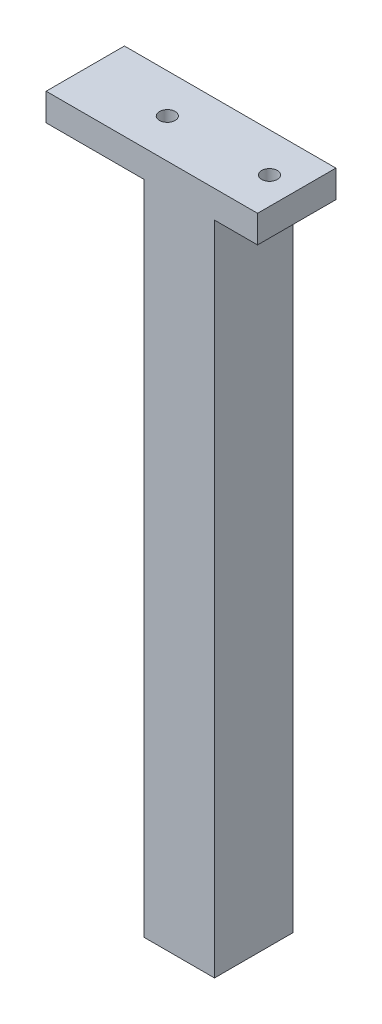
ISO-10303-21;
HEADER;
FILE_DESCRIPTION(('STEP AP214'),'2;1');
FILE_NAME('part.step','',(''),(''),'','','');
FILE_SCHEMA(('AUTOMOTIVE_DESIGN { 1 0 10303 214 1 1 1 1 }'));
ENDSEC;
DATA;
#1=APPLICATION_CONTEXT('core data for automotive mechanical design processes');
#2=APPLICATION_PROTOCOL_DEFINITION('international standard','automotive_design',2000,#1);
#3=PRODUCT_CONTEXT('',#1,'mechanical');
#4=PRODUCT('Part','Part','',(#3));
#5=PRODUCT_RELATED_PRODUCT_CATEGORY('part','',(#4));
#6=PRODUCT_DEFINITION_FORMATION('','',#4);
#7=PRODUCT_DEFINITION_CONTEXT('part definition',#1,'design');
#8=PRODUCT_DEFINITION('design','',#6,#7);
#9=PRODUCT_DEFINITION_SHAPE('','',#8);
#10=(LENGTH_UNIT() NAMED_UNIT(*) SI_UNIT(.MILLI.,.METRE.));
#11=(NAMED_UNIT(*) PLANE_ANGLE_UNIT() SI_UNIT($,.RADIAN.));
#12=(NAMED_UNIT(*) SI_UNIT($,.STERADIAN.) SOLID_ANGLE_UNIT());
#13=UNCERTAINTY_MEASURE_WITH_UNIT(LENGTH_MEASURE(1.E-05),#10,'distance_accuracy_value','');
#14=(GEOMETRIC_REPRESENTATION_CONTEXT(3) GLOBAL_UNCERTAINTY_ASSIGNED_CONTEXT((#13)) GLOBAL_UNIT_ASSIGNED_CONTEXT((#10,
#11,#12)) REPRESENTATION_CONTEXT('',''));
#15=CARTESIAN_POINT('',(0.,0.,0.));
#16=DIRECTION('',(0.,0.,1.));
#17=DIRECTION('',(1.,0.,0.));
#18=AXIS2_PLACEMENT_3D('',#15,#16,#17);
#19=CARTESIAN_POINT('',(0.,0.,0.));
#20=DIRECTION('',(0.,1.,0.));
#21=DIRECTION('',(0.,0.,1.));
#22=AXIS2_PLACEMENT_3D('',#19,#20,#21);
#23=PLANE('',#22);
#24=CARTESIAN_POINT('',(-12.3043777038528,0.,-0.298458403343756));
#25=DIRECTION('',(0.,1.,0.));
#26=DIRECTION('',(0.,0.,1.));
#27=AXIS2_PLACEMENT_3D('',#24,#25,#26);
#28=CIRCLE('',#27,2.);
#29=CARTESIAN_POINT('',(-12.3043777038528,0.,1.70154159665624));
#30=VERTEX_POINT('',#29);
#31=EDGE_CURVE('E230',#30,#30,#28,.T.);
#32=ORIENTED_EDGE('',*,*,#31,.T.);
#33=EDGE_LOOP('',(#32));
#34=FACE_BOUND('',#33,.T.);
#35=DIRECTION('',(0.,0.,-1.));
#36=VECTOR('',#35,1.);
#37=CARTESIAN_POINT('',(-8.25437770385284,0.,9.70154159665624));
#38=LINE('',#37,#36);
#39=CARTESIAN_POINT('',(-8.25437770385284,0.,9.70154159665625));
#40=VERTEX_POINT('',#39);
#41=CARTESIAN_POINT('',(-8.25437770385284,0.,-10.2984584033438));
#42=VERTEX_POINT('',#41);
#43=EDGE_CURVE('E58',#40,#42,#38,.T.);
#44=ORIENTED_EDGE('',*,*,#43,.F.);
#45=DIRECTION('',(1.,0.,0.));
#46=VECTOR('',#45,1.);
#47=CARTESIAN_POINT('',(-19.2543777038528,0.,9.70154159665625));
#48=LINE('',#47,#46);
#49=CARTESIAN_POINT('',(-33.2543777038528,0.,9.70154159665625));
#50=VERTEX_POINT('',#49);
#51=EDGE_CURVE('E139',#50,#40,#48,.T.);
#52=ORIENTED_EDGE('',*,*,#51,.F.);
#53=DIRECTION('',(0.,0.,1.));
#54=VECTOR('',#53,1.);
#55=CARTESIAN_POINT('',(-33.2543777038528,0.,-10.2984584033438));
#56=LINE('',#55,#54);
#57=CARTESIAN_POINT('',(-33.2543777038528,0.,-10.2984584033438));
#58=VERTEX_POINT('',#57);
#59=EDGE_CURVE('E138',#58,#50,#56,.T.);
#60=ORIENTED_EDGE('',*,*,#59,.F.);
#61=DIRECTION('',(-1.,0.,0.));
#62=VECTOR('',#61,1.);
#63=CARTESIAN_POINT('',(-19.2543777038528,0.,-10.2984584033438));
#64=LINE('',#63,#62);
#65=EDGE_CURVE('E125',#42,#58,#64,.T.);
#66=ORIENTED_EDGE('',*,*,#65,.F.);
#67=EDGE_LOOP('',(#44,#52,#60,#66));
#68=FACE_BOUND('',#67,.T.);
#69=ADVANCED_FACE('F33',(#34,#68),#23,.F.);
#70=CARTESIAN_POINT('',(13.7956222961472,0.,-0.298458403343756));
#71=DIRECTION('',(0.,1.,0.));
#72=DIRECTION('',(0.,0.,1.));
#73=AXIS2_PLACEMENT_3D('',#70,#71,#72);
#74=CIRCLE('',#73,2.);
#75=CARTESIAN_POINT('',(13.7956222961472,0.,1.70154159665625));
#76=VERTEX_POINT('',#75);
#77=EDGE_CURVE('E223',#76,#76,#74,.T.);
#78=ORIENTED_EDGE('',*,*,#77,.T.);
#79=EDGE_LOOP('',(#78));
#80=FACE_BOUND('',#79,.T.);
#81=DIRECTION('',(0.,0.,1.));
#82=VECTOR('',#81,1.);
#83=CARTESIAN_POINT('',(9.74562229614715,0.,9.70154159665624));
#84=LINE('',#83,#82);
#85=CARTESIAN_POINT('',(9.74562229614715,0.,-10.2984584033438));
#86=VERTEX_POINT('',#85);
#87=CARTESIAN_POINT('',(9.74562229614715,0.,9.70154159665624));
#88=VERTEX_POINT('',#87);
#89=EDGE_CURVE('E187',#86,#88,#84,.T.);
#90=ORIENTED_EDGE('',*,*,#89,.F.);
#91=CARTESIAN_POINT('',(20.7456222961472,0.,-10.2984584033438));
#92=VERTEX_POINT('',#91);
#93=EDGE_CURVE('E134',#92,#86,#64,.T.);
#94=ORIENTED_EDGE('',*,*,#93,.F.);
#95=DIRECTION('',(0.,0.,-1.));
#96=VECTOR('',#95,1.);
#97=CARTESIAN_POINT('',(20.7456222961472,0.,-10.2984584033438));
#98=LINE('',#97,#96);
#99=CARTESIAN_POINT('',(20.7456222961472,0.,9.70154159665624));
#100=VERTEX_POINT('',#99);
#101=EDGE_CURVE('E135',#100,#92,#98,.T.);
#102=ORIENTED_EDGE('',*,*,#101,.F.);
#103=EDGE_CURVE('E233',#88,#100,#48,.T.);
#104=ORIENTED_EDGE('',*,*,#103,.F.);
#105=EDGE_LOOP('',(#90,#94,#102,#104));
#106=FACE_BOUND('',#105,.T.);
#107=ADVANCED_FACE('F259',(#80,#106),#23,.F.);
#108=CARTESIAN_POINT('',(-19.2543777038528,7.,9.70154159665625));
#109=DIRECTION('',(0.,0.,-1.));
#110=DIRECTION('',(-1.,0.,0.));
#111=AXIS2_PLACEMENT_3D('',#108,#109,#110);
#112=PLANE('',#111);
#113=ORIENTED_EDGE('',*,*,#51,.T.);
#114=DIRECTION('',(0.,1.,0.));
#115=VECTOR('',#114,1.);
#116=CARTESIAN_POINT('',(-8.25437770385284,-167.64,9.70154159665624));
#117=LINE('',#116,#115);
#118=CARTESIAN_POINT('',(-8.25437770385284,-167.64,9.70154159665624));
#119=VERTEX_POINT('',#118);
#120=EDGE_CURVE('E193',#119,#40,#117,.T.);
#121=ORIENTED_EDGE('',*,*,#120,.F.);
#122=DIRECTION('',(-1.,0.,0.));
#123=VECTOR('',#122,1.);
#124=CARTESIAN_POINT('',(-8.25437770385284,-167.64,9.70154159665624));
#125=LINE('',#124,#123);
#126=CARTESIAN_POINT('',(9.74562229614715,-167.64,9.70154159665624));
#127=VERTEX_POINT('',#126);
#128=EDGE_CURVE('E191',#127,#119,#125,.T.);
#129=ORIENTED_EDGE('',*,*,#128,.F.);
#130=DIRECTION('',(0.,1.,0.));
#131=VECTOR('',#130,1.);
#132=CARTESIAN_POINT('',(9.74562229614715,-167.64,9.70154159665624));
#133=LINE('',#132,#131);
#134=EDGE_CURVE('E203',#127,#88,#133,.T.);
#135=ORIENTED_EDGE('',*,*,#134,.T.);
#136=ORIENTED_EDGE('',*,*,#103,.T.);
#137=DIRECTION('',(0.,-1.,0.));
#138=VECTOR('',#137,1.);
#139=CARTESIAN_POINT('',(20.7456222961472,7.,9.70154159665624));
#140=LINE('',#139,#138);
#141=CARTESIAN_POINT('',(20.7456222961472,7.,9.70154159665624));
#142=VERTEX_POINT('',#141);
#143=EDGE_CURVE('E11',#142,#100,#140,.T.);
#144=ORIENTED_EDGE('',*,*,#143,.F.);
#145=DIRECTION('',(1.,0.,0.));
#146=VECTOR('',#145,1.);
#147=CARTESIAN_POINT('',(-19.2543777038528,7.,9.70154159665625));
#148=LINE('',#147,#146);
#149=CARTESIAN_POINT('',(-33.2543777038528,7.,9.70154159665625));
#150=VERTEX_POINT('',#149);
#151=EDGE_CURVE('E236',#150,#142,#148,.T.);
#152=ORIENTED_EDGE('',*,*,#151,.F.);
#153=DIRECTION('',(0.,1.,0.));
#154=VECTOR('',#153,1.);
#155=CARTESIAN_POINT('',(-33.2543777038528,0.,9.70154159665625));
#156=LINE('',#155,#154);
#157=EDGE_CURVE('E143',#50,#150,#156,.T.);
#158=ORIENTED_EDGE('',*,*,#157,.F.);
#159=EDGE_LOOP('',(#113,#121,#129,#135,#136,#144,#152,#158));
#160=FACE_BOUND('',#159,.T.);
#161=ADVANCED_FACE('F35',(#160),#112,.F.);
#162=CARTESIAN_POINT('',(20.7456222961472,7.,-10.2984584033438));
#163=DIRECTION('',(-1.,0.,0.));
#164=DIRECTION('',(0.,0.,1.));
#165=AXIS2_PLACEMENT_3D('',#162,#163,#164);
#166=PLANE('',#165);
#167=ORIENTED_EDGE('',*,*,#101,.T.);
#168=DIRECTION('',(0.,-1.,0.));
#169=VECTOR('',#168,1.);
#170=CARTESIAN_POINT('',(20.7456222961472,7.,-10.2984584033438));
#171=LINE('',#170,#169);
#172=CARTESIAN_POINT('',(20.7456222961472,7.,-10.2984584033438));
#173=VERTEX_POINT('',#172);
#174=EDGE_CURVE('E42',#173,#92,#171,.T.);
#175=ORIENTED_EDGE('',*,*,#174,.F.);
#176=DIRECTION('',(0.,0.,-1.));
#177=VECTOR('',#176,1.);
#178=CARTESIAN_POINT('',(20.7456222961472,7.,-10.2984584033438));
#179=LINE('',#178,#177);
#180=EDGE_CURVE('E238',#142,#173,#179,.T.);
#181=ORIENTED_EDGE('',*,*,#180,.F.);
#182=ORIENTED_EDGE('',*,*,#143,.T.);
#183=EDGE_LOOP('',(#167,#175,#181,#182));
#184=FACE_BOUND('',#183,.T.);
#185=ADVANCED_FACE('F290',(#184),#166,.F.);
#186=CARTESIAN_POINT('',(-19.2543777038528,7.,-10.2984584033438));
#187=DIRECTION('',(0.,0.,1.));
#188=DIRECTION('',(1.,0.,0.));
#189=AXIS2_PLACEMENT_3D('',#186,#187,#188);
#190=PLANE('',#189);
#191=ORIENTED_EDGE('',*,*,#93,.T.);
#192=DIRECTION('',(0.,1.,0.));
#193=VECTOR('',#192,1.);
#194=CARTESIAN_POINT('',(9.74562229614715,-167.64,-10.2984584033438));
#195=LINE('',#194,#193);
#196=CARTESIAN_POINT('',(9.74562229614715,-167.64,-10.2984584033438));
#197=VERTEX_POINT('',#196);
#198=EDGE_CURVE('E208',#197,#86,#195,.T.);
#199=ORIENTED_EDGE('',*,*,#198,.F.);
#200=DIRECTION('',(1.,0.,0.));
#201=VECTOR('',#200,1.);
#202=CARTESIAN_POINT('',(-8.25437770385284,-167.64,-10.2984584033438));
#203=LINE('',#202,#201);
#204=CARTESIAN_POINT('',(-8.25437770385284,-167.64,-10.2984584033438));
#205=VERTEX_POINT('',#204);
#206=EDGE_CURVE('E186',#205,#197,#203,.T.);
#207=ORIENTED_EDGE('',*,*,#206,.F.);
#208=DIRECTION('',(0.,1.,0.));
#209=VECTOR('',#208,1.);
#210=CARTESIAN_POINT('',(-8.25437770385284,-167.64,-10.2984584033438));
#211=LINE('',#210,#209);
#212=EDGE_CURVE('E133',#205,#42,#211,.T.);
#213=ORIENTED_EDGE('',*,*,#212,.T.);
#214=ORIENTED_EDGE('',*,*,#65,.T.);
#215=DIRECTION('',(0.,-1.,0.));
#216=VECTOR('',#215,1.);
#217=CARTESIAN_POINT('',(-33.2543777038528,7.,-10.2984584033438));
#218=LINE('',#217,#216);
#219=CARTESIAN_POINT('',(-33.2543777038528,7.,-10.2984584033438));
#220=VERTEX_POINT('',#219);
#221=EDGE_CURVE('E131',#220,#58,#218,.T.);
#222=ORIENTED_EDGE('',*,*,#221,.F.);
#223=DIRECTION('',(-1.,0.,0.));
#224=VECTOR('',#223,1.);
#225=CARTESIAN_POINT('',(-19.2543777038528,7.,-10.2984584033438));
#226=LINE('',#225,#224);
#227=EDGE_CURVE('E240',#173,#220,#226,.T.);
#228=ORIENTED_EDGE('',*,*,#227,.F.);
#229=ORIENTED_EDGE('',*,*,#174,.T.);
#230=EDGE_LOOP('',(#191,#199,#207,#213,#214,#222,#228,#229));
#231=FACE_BOUND('',#230,.T.);
#232=ADVANCED_FACE('F128',(#231),#190,.F.);
#233=CARTESIAN_POINT('',(0.,7.,0.));
#234=DIRECTION('',(0.,1.,0.));
#235=DIRECTION('',(0.,0.,1.));
#236=AXIS2_PLACEMENT_3D('',#233,#234,#235);
#237=PLANE('',#236);
#238=CARTESIAN_POINT('',(13.7956222961472,7.,-0.298458403343756));
#239=DIRECTION('',(0.,1.,0.));
#240=DIRECTION('',(0.,0.,1.));
#241=AXIS2_PLACEMENT_3D('',#238,#239,#240);
#242=CIRCLE('',#241,2.);
#243=CARTESIAN_POINT('',(13.7956222961472,7.,1.70154159665625));
#244=VERTEX_POINT('',#243);
#245=EDGE_CURVE('E221',#244,#244,#242,.T.);
#246=ORIENTED_EDGE('',*,*,#245,.F.);
#247=EDGE_LOOP('',(#246));
#248=FACE_BOUND('',#247,.T.);
#249=CARTESIAN_POINT('',(-12.3043777038528,7.,-0.298458403343756));
#250=DIRECTION('',(0.,1.,0.));
#251=DIRECTION('',(0.,0.,1.));
#252=AXIS2_PLACEMENT_3D('',#249,#250,#251);
#253=CIRCLE('',#252,2.);
#254=CARTESIAN_POINT('',(-12.3043777038528,7.,1.70154159665624));
#255=VERTEX_POINT('',#254);
#256=EDGE_CURVE('E228',#255,#255,#253,.T.);
#257=ORIENTED_EDGE('',*,*,#256,.F.);
#258=EDGE_LOOP('',(#257));
#259=FACE_BOUND('',#258,.T.);
#260=ORIENTED_EDGE('',*,*,#227,.T.);
#261=DIRECTION('',(0.,0.,-1.));
#262=VECTOR('',#261,1.);
#263=CARTESIAN_POINT('',(-33.2543777038528,7.,9.70154159665625));
#264=LINE('',#263,#262);
#265=EDGE_CURVE('E148',#150,#220,#264,.T.);
#266=ORIENTED_EDGE('',*,*,#265,.F.);
#267=ORIENTED_EDGE('',*,*,#151,.T.);
#268=ORIENTED_EDGE('',*,*,#180,.T.);
#269=EDGE_LOOP('',(#260,#266,#267,#268));
#270=FACE_BOUND('',#269,.T.);
#271=ADVANCED_FACE('F287',(#248,#259,#270),#237,.T.);
#272=CARTESIAN_POINT('',(-12.3043777038528,0.,-0.298458403343756));
#273=DIRECTION('',(0.,1.,0.));
#274=DIRECTION('',(0.,0.,1.));
#275=AXIS2_PLACEMENT_3D('',#272,#273,#274);
#276=CYLINDRICAL_SURFACE('',#275,2.);
#277=ORIENTED_EDGE('',*,*,#31,.F.);
#278=EDGE_LOOP('',(#277));
#279=FACE_BOUND('',#278,.T.);
#280=ORIENTED_EDGE('',*,*,#256,.T.);
#281=EDGE_LOOP('',(#280));
#282=FACE_BOUND('',#281,.T.);
#283=ADVANCED_FACE('F275',(#279,#282),#276,.F.);
#284=CARTESIAN_POINT('',(13.7956222961472,0.,-0.298458403343756));
#285=DIRECTION('',(0.,1.,0.));
#286=DIRECTION('',(0.,0.,1.));
#287=AXIS2_PLACEMENT_3D('',#284,#285,#286);
#288=CYLINDRICAL_SURFACE('',#287,2.);
#289=ORIENTED_EDGE('',*,*,#77,.F.);
#290=EDGE_LOOP('',(#289));
#291=FACE_BOUND('',#290,.T.);
#292=ORIENTED_EDGE('',*,*,#245,.T.);
#293=EDGE_LOOP('',(#292));
#294=FACE_BOUND('',#293,.T.);
#295=ADVANCED_FACE('F268',(#291,#294),#288,.F.);
#296=CARTESIAN_POINT('',(-8.25437770385284,-167.64,9.70154159665624));
#297=DIRECTION('',(1.,0.,0.));
#298=DIRECTION('',(0.,0.,-1.));
#299=AXIS2_PLACEMENT_3D('',#296,#297,#298);
#300=PLANE('',#299);
#301=ORIENTED_EDGE('',*,*,#43,.T.);
#302=ORIENTED_EDGE('',*,*,#212,.F.);
#303=DIRECTION('',(0.,0.,-1.));
#304=VECTOR('',#303,1.);
#305=CARTESIAN_POINT('',(-8.25437770385284,-167.64,9.70154159665624));
#306=LINE('',#305,#304);
#307=EDGE_CURVE('E183',#119,#205,#306,.T.);
#308=ORIENTED_EDGE('',*,*,#307,.F.);
#309=ORIENTED_EDGE('',*,*,#120,.T.);
#310=EDGE_LOOP('',(#301,#302,#308,#309));
#311=FACE_BOUND('',#310,.T.);
#312=ADVANCED_FACE('F266',(#311),#300,.F.);
#313=CARTESIAN_POINT('',(9.74562229614715,-167.64,9.70154159665624));
#314=DIRECTION('',(-1.,0.,0.));
#315=DIRECTION('',(0.,0.,1.));
#316=AXIS2_PLACEMENT_3D('',#313,#314,#315);
#317=PLANE('',#316);
#318=ORIENTED_EDGE('',*,*,#89,.T.);
#319=ORIENTED_EDGE('',*,*,#134,.F.);
#320=DIRECTION('',(0.,0.,1.));
#321=VECTOR('',#320,1.);
#322=CARTESIAN_POINT('',(9.74562229614715,-167.64,9.70154159665624));
#323=LINE('',#322,#321);
#324=EDGE_CURVE('E189',#197,#127,#323,.T.);
#325=ORIENTED_EDGE('',*,*,#324,.F.);
#326=ORIENTED_EDGE('',*,*,#198,.T.);
#327=EDGE_LOOP('',(#318,#319,#325,#326));
#328=FACE_BOUND('',#327,.T.);
#329=ADVANCED_FACE('F262',(#328),#317,.F.);
#330=CARTESIAN_POINT('',(0.,-167.64,0.));
#331=DIRECTION('',(0.,-1.,0.));
#332=DIRECTION('',(0.,0.,-1.));
#333=AXIS2_PLACEMENT_3D('',#330,#331,#332);
#334=PLANE('',#333);
#335=DIRECTION('',(1.,0.,0.));
#336=VECTOR('',#335,1.);
#337=CARTESIAN_POINT('',(-4.25437770385284,-167.64,-6.29845840334376));
#338=LINE('',#337,#336);
#339=CARTESIAN_POINT('',(-4.25437770385284,-167.64,-6.29845840334376));
#340=VERTEX_POINT('',#339);
#341=CARTESIAN_POINT('',(5.74562229614716,-167.64,-6.29845840334376));
#342=VERTEX_POINT('',#341);
#343=EDGE_CURVE('E159',#340,#342,#338,.T.);
#344=ORIENTED_EDGE('',*,*,#343,.F.);
#345=DIRECTION('',(0.,0.,-1.));
#346=VECTOR('',#345,1.);
#347=CARTESIAN_POINT('',(-4.25437770385284,-167.64,5.70154159665624));
#348=LINE('',#347,#346);
#349=CARTESIAN_POINT('',(-4.25437770385284,-167.64,5.70154159665624));
#350=VERTEX_POINT('',#349);
#351=EDGE_CURVE('E153',#350,#340,#348,.T.);
#352=ORIENTED_EDGE('',*,*,#351,.F.);
#353=DIRECTION('',(-1.,0.,0.));
#354=VECTOR('',#353,1.);
#355=CARTESIAN_POINT('',(-4.25437770385284,-167.64,5.70154159665624));
#356=LINE('',#355,#354);
#357=CARTESIAN_POINT('',(5.74562229614715,-167.64,5.70154159665624));
#358=VERTEX_POINT('',#357);
#359=EDGE_CURVE('E50',#358,#350,#356,.T.);
#360=ORIENTED_EDGE('',*,*,#359,.F.);
#361=DIRECTION('',(0.,0.,1.));
#362=VECTOR('',#361,1.);
#363=CARTESIAN_POINT('',(5.74562229614715,-167.64,5.70154159665624));
#364=LINE('',#363,#362);
#365=EDGE_CURVE('E156',#342,#358,#364,.T.);
#366=ORIENTED_EDGE('',*,*,#365,.F.);
#367=EDGE_LOOP('',(#344,#352,#360,#366));
#368=FACE_BOUND('',#367,.T.);
#369=ORIENTED_EDGE('',*,*,#307,.T.);
#370=ORIENTED_EDGE('',*,*,#206,.T.);
#371=ORIENTED_EDGE('',*,*,#324,.T.);
#372=ORIENTED_EDGE('',*,*,#128,.T.);
#373=EDGE_LOOP('',(#369,#370,#371,#372));
#374=FACE_BOUND('',#373,.T.);
#375=ADVANCED_FACE('F265',(#368,#374),#334,.T.);
#376=CARTESIAN_POINT('',(0.,0.,0.));
#377=DIRECTION('',(0.,1.,0.));
#378=DIRECTION('',(0.,0.,1.));
#379=AXIS2_PLACEMENT_3D('',#376,#377,#378);
#380=PLANE('',#379);
#381=DIRECTION('',(0.,0.,-1.));
#382=VECTOR('',#381,1.);
#383=CARTESIAN_POINT('',(-4.25437770385284,0.,5.70154159665624));
#384=LINE('',#383,#382);
#385=CARTESIAN_POINT('',(-4.25437770385284,0.,5.70154159665624));
#386=VERTEX_POINT('',#385);
#387=CARTESIAN_POINT('',(-4.25437770385284,0.,-6.29845840334376));
#388=VERTEX_POINT('',#387);
#389=EDGE_CURVE('E167',#386,#388,#384,.T.);
#390=ORIENTED_EDGE('',*,*,#389,.T.);
#391=DIRECTION('',(1.,0.,0.));
#392=VECTOR('',#391,1.);
#393=CARTESIAN_POINT('',(-4.25437770385284,0.,-6.29845840334376));
#394=LINE('',#393,#392);
#395=CARTESIAN_POINT('',(5.74562229614716,0.,-6.29845840334376));
#396=VERTEX_POINT('',#395);
#397=EDGE_CURVE('E155',#388,#396,#394,.T.);
#398=ORIENTED_EDGE('',*,*,#397,.T.);
#399=DIRECTION('',(0.,0.,1.));
#400=VECTOR('',#399,1.);
#401=CARTESIAN_POINT('',(5.74562229614715,0.,5.70154159665624));
#402=LINE('',#401,#400);
#403=CARTESIAN_POINT('',(5.74562229614715,0.,5.70154159665624));
#404=VERTEX_POINT('',#403);
#405=EDGE_CURVE('E176',#396,#404,#402,.T.);
#406=ORIENTED_EDGE('',*,*,#405,.T.);
#407=DIRECTION('',(-1.,0.,0.));
#408=VECTOR('',#407,1.);
#409=CARTESIAN_POINT('',(-4.25437770385284,0.,5.70154159665624));
#410=LINE('',#409,#408);
#411=EDGE_CURVE('E172',#404,#386,#410,.T.);
#412=ORIENTED_EDGE('',*,*,#411,.T.);
#413=EDGE_LOOP('',(#390,#398,#406,#412));
#414=FACE_BOUND('',#413,.T.);
#415=ADVANCED_FACE('F340',(#414),#380,.F.);
#416=CARTESIAN_POINT('',(-4.25437770385284,15.6204993518133,-6.29845840334376));
#417=DIRECTION('',(0.,0.,-1.));
#418=DIRECTION('',(-1.,0.,0.));
#419=AXIS2_PLACEMENT_3D('',#416,#417,#418);
#420=PLANE('',#419);
#421=DIRECTION('',(0.,-1.,0.));
#422=VECTOR('',#421,1.);
#423=CARTESIAN_POINT('',(-4.25437770385284,15.6204993518133,-6.29845840334376));
#424=LINE('',#423,#422);
#425=EDGE_CURVE('E170',#388,#340,#424,.T.);
#426=ORIENTED_EDGE('',*,*,#425,.T.);
#427=ORIENTED_EDGE('',*,*,#343,.T.);
#428=DIRECTION('',(0.,-1.,0.));
#429=VECTOR('',#428,1.);
#430=CARTESIAN_POINT('',(5.74562229614716,15.6204993518133,-6.29845840334376));
#431=LINE('',#430,#429);
#432=EDGE_CURVE('E166',#396,#342,#431,.T.);
#433=ORIENTED_EDGE('',*,*,#432,.F.);
#434=ORIENTED_EDGE('',*,*,#397,.F.);
#435=EDGE_LOOP('',(#426,#427,#433,#434));
#436=FACE_BOUND('',#435,.T.);
#437=ADVANCED_FACE('F350',(#436),#420,.F.);
#438=CARTESIAN_POINT('',(5.74562229614715,15.6204993518133,5.70154159665624));
#439=DIRECTION('',(1.,0.,0.));
#440=DIRECTION('',(0.,0.,-1.));
#441=AXIS2_PLACEMENT_3D('',#438,#439,#440);
#442=PLANE('',#441);
#443=ORIENTED_EDGE('',*,*,#432,.T.);
#444=ORIENTED_EDGE('',*,*,#365,.T.);
#445=DIRECTION('',(0.,-1.,0.));
#446=VECTOR('',#445,1.);
#447=CARTESIAN_POINT('',(5.74562229614715,15.6204993518133,5.70154159665624));
#448=LINE('',#447,#446);
#449=EDGE_CURVE('E175',#404,#358,#448,.T.);
#450=ORIENTED_EDGE('',*,*,#449,.F.);
#451=ORIENTED_EDGE('',*,*,#405,.F.);
#452=EDGE_LOOP('',(#443,#444,#450,#451));
#453=FACE_BOUND('',#452,.T.);
#454=ADVANCED_FACE('F360',(#453),#442,.F.);
#455=CARTESIAN_POINT('',(-4.25437770385284,15.6204993518133,5.70154159665624));
#456=DIRECTION('',(0.,0.,1.));
#457=DIRECTION('',(1.,0.,0.));
#458=AXIS2_PLACEMENT_3D('',#455,#456,#457);
#459=PLANE('',#458);
#460=ORIENTED_EDGE('',*,*,#449,.T.);
#461=ORIENTED_EDGE('',*,*,#359,.T.);
#462=DIRECTION('',(0.,-1.,0.));
#463=VECTOR('',#462,1.);
#464=CARTESIAN_POINT('',(-4.25437770385284,15.6204993518133,5.70154159665624));
#465=LINE('',#464,#463);
#466=EDGE_CURVE('E171',#386,#350,#465,.T.);
#467=ORIENTED_EDGE('',*,*,#466,.F.);
#468=ORIENTED_EDGE('',*,*,#411,.F.);
#469=EDGE_LOOP('',(#460,#461,#467,#468));
#470=FACE_BOUND('',#469,.T.);
#471=ADVANCED_FACE('F370',(#470),#459,.F.);
#472=CARTESIAN_POINT('',(-4.25437770385284,15.6204993518133,5.70154159665624));
#473=DIRECTION('',(-1.,0.,0.));
#474=DIRECTION('',(0.,0.,1.));
#475=AXIS2_PLACEMENT_3D('',#472,#473,#474);
#476=PLANE('',#475);
#477=ORIENTED_EDGE('',*,*,#466,.T.);
#478=ORIENTED_EDGE('',*,*,#351,.T.);
#479=ORIENTED_EDGE('',*,*,#425,.F.);
#480=ORIENTED_EDGE('',*,*,#389,.F.);
#481=EDGE_LOOP('',(#477,#478,#479,#480));
#482=FACE_BOUND('',#481,.T.);
#483=ADVANCED_FACE('F380',(#482),#476,.F.);
#484=CARTESIAN_POINT('',(-33.2543777038528,0.,0.));
#485=DIRECTION('',(-1.,0.,0.));
#486=DIRECTION('',(0.,0.,1.));
#487=AXIS2_PLACEMENT_3D('',#484,#485,#486);
#488=PLANE('',#487);
#489=ORIENTED_EDGE('',*,*,#221,.T.);
#490=ORIENTED_EDGE('',*,*,#59,.T.);
#491=ORIENTED_EDGE('',*,*,#157,.T.);
#492=ORIENTED_EDGE('',*,*,#265,.T.);
#493=EDGE_LOOP('',(#489,#490,#491,#492));
#494=FACE_BOUND('',#493,.T.);
#495=ADVANCED_FACE('F146',(#494),#488,.T.);
#496=CLOSED_SHELL('',(#69,#107,#161,#185,#232,#271,#283,#295,#312,#329,#375,#415,#437,#454,#471,
#483,#495));
#497=MANIFOLD_SOLID_BREP('B2',#496);
#498=ADVANCED_BREP_SHAPE_REPRESENTATION('',(#18,#497),#14);
#499=SHAPE_DEFINITION_REPRESENTATION(#9,#498);
ENDSEC;
END-ISO-10303-21;
